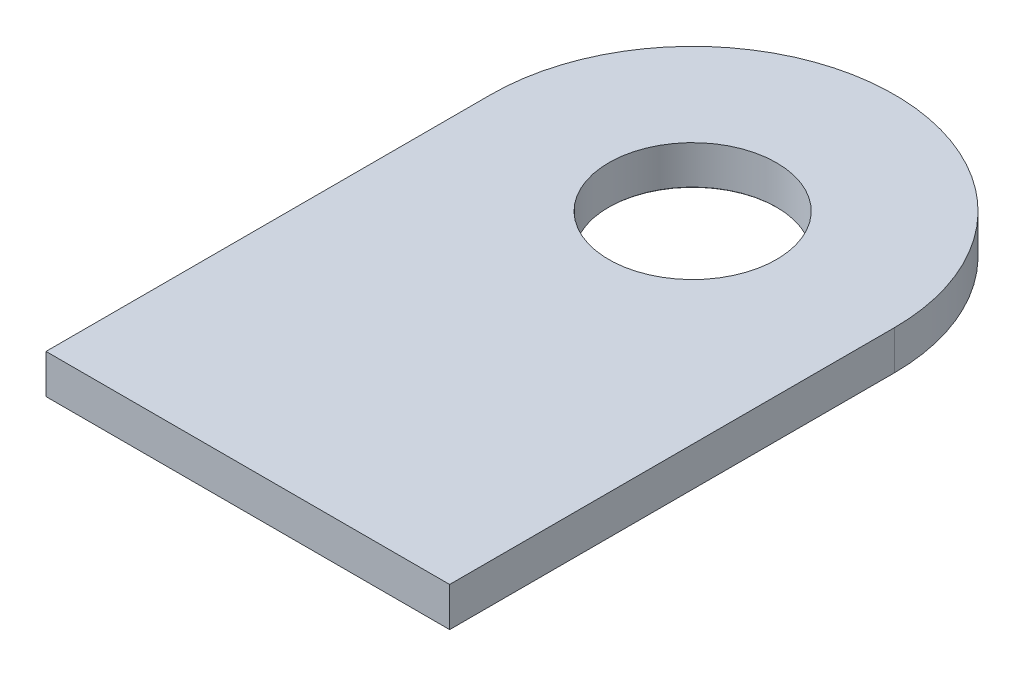
ISO-10303-21;
HEADER;
FILE_DESCRIPTION(('STEP AP214'),'2;1');
FILE_NAME('part.step','',(''),(''),'','','');
FILE_SCHEMA(('AUTOMOTIVE_DESIGN { 1 0 10303 214 1 1 1 1 }'));
ENDSEC;
DATA;
#1=APPLICATION_CONTEXT('core data for automotive mechanical design processes');
#2=APPLICATION_PROTOCOL_DEFINITION('international standard','automotive_design',2000,#1);
#3=PRODUCT_CONTEXT('',#1,'mechanical');
#4=PRODUCT('Part','Part','',(#3));
#5=PRODUCT_RELATED_PRODUCT_CATEGORY('part','',(#4));
#6=PRODUCT_DEFINITION_FORMATION('','',#4);
#7=PRODUCT_DEFINITION_CONTEXT('part definition',#1,'design');
#8=PRODUCT_DEFINITION('design','',#6,#7);
#9=PRODUCT_DEFINITION_SHAPE('','',#8);
#10=(LENGTH_UNIT() NAMED_UNIT(*) SI_UNIT(.MILLI.,.METRE.));
#11=(NAMED_UNIT(*) PLANE_ANGLE_UNIT() SI_UNIT($,.RADIAN.));
#12=(NAMED_UNIT(*) SI_UNIT($,.STERADIAN.) SOLID_ANGLE_UNIT());
#13=UNCERTAINTY_MEASURE_WITH_UNIT(LENGTH_MEASURE(1.E-05),#10,'distance_accuracy_value','');
#14=(GEOMETRIC_REPRESENTATION_CONTEXT(3) GLOBAL_UNCERTAINTY_ASSIGNED_CONTEXT((#13)) GLOBAL_UNIT_ASSIGNED_CONTEXT((#10,
#11,#12)) REPRESENTATION_CONTEXT('',''));
#15=CARTESIAN_POINT('',(0.,0.,0.));
#16=DIRECTION('',(0.,0.,1.));
#17=DIRECTION('',(1.,0.,0.));
#18=AXIS2_PLACEMENT_3D('',#15,#16,#17);
#19=CARTESIAN_POINT('',(0.,1.54,0.));
#20=DIRECTION('',(0.,-1.,0.));
#21=DIRECTION('',(0.,0.,-1.));
#22=AXIS2_PLACEMENT_3D('',#19,#20,#21);
#23=CYLINDRICAL_SURFACE('',#22,7.94);
#24=CARTESIAN_POINT('',(0.,0.,0.));
#25=DIRECTION('',(0.,1.,0.));
#26=DIRECTION('',(0.,0.,1.));
#27=AXIS2_PLACEMENT_3D('',#24,#25,#26);
#28=CIRCLE('',#27,7.94);
#29=CARTESIAN_POINT('',(7.94,0.,0.));
#30=VERTEX_POINT('',#29);
#31=CARTESIAN_POINT('',(-7.94,0.,0.));
#32=VERTEX_POINT('',#31);
#33=EDGE_CURVE('E131',#30,#32,#28,.T.);
#34=ORIENTED_EDGE('',*,*,#33,.T.);
#35=DIRECTION('',(0.,-1.,0.));
#36=VECTOR('',#35,1.);
#37=CARTESIAN_POINT('',(-7.94,1.54,0.));
#38=LINE('',#37,#36);
#39=CARTESIAN_POINT('',(-7.94,1.54,0.));
#40=VERTEX_POINT('',#39);
#41=EDGE_CURVE('E12',#40,#32,#38,.T.);
#42=ORIENTED_EDGE('',*,*,#41,.F.);
#43=CARTESIAN_POINT('',(0.,1.54,0.));
#44=DIRECTION('',(0.,1.,0.));
#45=DIRECTION('',(0.,0.,1.));
#46=AXIS2_PLACEMENT_3D('',#43,#44,#45);
#47=CIRCLE('',#46,7.94);
#48=CARTESIAN_POINT('',(7.94,1.54,0.));
#49=VERTEX_POINT('',#48);
#50=EDGE_CURVE('E102',#49,#40,#47,.T.);
#51=ORIENTED_EDGE('',*,*,#50,.F.);
#52=DIRECTION('',(0.,-1.,0.));
#53=VECTOR('',#52,1.);
#54=CARTESIAN_POINT('',(7.94,1.54,0.));
#55=LINE('',#54,#53);
#56=EDGE_CURVE('E114',#49,#30,#55,.T.);
#57=ORIENTED_EDGE('',*,*,#56,.T.);
#58=EDGE_LOOP('',(#34,#42,#51,#57));
#59=FACE_BOUND('',#58,.T.);
#60=ADVANCED_FACE('F50',(#59),#23,.T.);
#61=CARTESIAN_POINT('',(-7.94,1.54,0.));
#62=DIRECTION('',(1.,0.,0.));
#63=DIRECTION('',(0.,0.,-1.));
#64=AXIS2_PLACEMENT_3D('',#61,#62,#63);
#65=PLANE('',#64);
#66=DIRECTION('',(0.,0.,1.));
#67=VECTOR('',#66,1.);
#68=CARTESIAN_POINT('',(-7.94,0.,0.));
#69=LINE('',#68,#67);
#70=CARTESIAN_POINT('',(-7.94,0.,17.5));
#71=VERTEX_POINT('',#70);
#72=EDGE_CURVE('E107',#32,#71,#69,.T.);
#73=ORIENTED_EDGE('',*,*,#72,.T.);
#74=DIRECTION('',(0.,-1.,0.));
#75=VECTOR('',#74,1.);
#76=CARTESIAN_POINT('',(-7.94,1.54,17.5));
#77=LINE('',#76,#75);
#78=CARTESIAN_POINT('',(-7.94,1.54,17.5));
#79=VERTEX_POINT('',#78);
#80=EDGE_CURVE('E59',#79,#71,#77,.T.);
#81=ORIENTED_EDGE('',*,*,#80,.F.);
#82=DIRECTION('',(0.,0.,1.));
#83=VECTOR('',#82,1.);
#84=CARTESIAN_POINT('',(-7.94,1.54,0.));
#85=LINE('',#84,#83);
#86=EDGE_CURVE('E97',#40,#79,#85,.T.);
#87=ORIENTED_EDGE('',*,*,#86,.F.);
#88=ORIENTED_EDGE('',*,*,#41,.T.);
#89=EDGE_LOOP('',(#73,#81,#87,#88));
#90=FACE_BOUND('',#89,.T.);
#91=ADVANCED_FACE('F106',(#90),#65,.F.);
#92=CARTESIAN_POINT('',(0.,1.54,17.5));
#93=DIRECTION('',(0.,0.,-1.));
#94=DIRECTION('',(-1.,0.,0.));
#95=AXIS2_PLACEMENT_3D('',#92,#93,#94);
#96=PLANE('',#95);
#97=DIRECTION('',(1.,0.,0.));
#98=VECTOR('',#97,1.);
#99=CARTESIAN_POINT('',(0.,0.,17.5));
#100=LINE('',#99,#98);
#101=CARTESIAN_POINT('',(7.94,0.,17.5));
#102=VERTEX_POINT('',#101);
#103=EDGE_CURVE('E84',#71,#102,#100,.T.);
#104=ORIENTED_EDGE('',*,*,#103,.T.);
#105=DIRECTION('',(0.,-1.,0.));
#106=VECTOR('',#105,1.);
#107=CARTESIAN_POINT('',(7.94,1.54,17.5));
#108=LINE('',#107,#106);
#109=CARTESIAN_POINT('',(7.94,1.54,17.5));
#110=VERTEX_POINT('',#109);
#111=EDGE_CURVE('E109',#110,#102,#108,.T.);
#112=ORIENTED_EDGE('',*,*,#111,.F.);
#113=DIRECTION('',(1.,0.,0.));
#114=VECTOR('',#113,1.);
#115=CARTESIAN_POINT('',(0.,1.54,17.5));
#116=LINE('',#115,#114);
#117=EDGE_CURVE('E100',#79,#110,#116,.T.);
#118=ORIENTED_EDGE('',*,*,#117,.F.);
#119=ORIENTED_EDGE('',*,*,#80,.T.);
#120=EDGE_LOOP('',(#104,#112,#118,#119));
#121=FACE_BOUND('',#120,.T.);
#122=ADVANCED_FACE('F110',(#121),#96,.F.);
#123=CARTESIAN_POINT('',(7.94,1.54,0.));
#124=DIRECTION('',(-1.,0.,0.));
#125=DIRECTION('',(0.,0.,1.));
#126=AXIS2_PLACEMENT_3D('',#123,#124,#125);
#127=PLANE('',#126);
#128=DIRECTION('',(0.,0.,-1.));
#129=VECTOR('',#128,1.);
#130=CARTESIAN_POINT('',(7.94,0.,0.));
#131=LINE('',#130,#129);
#132=EDGE_CURVE('E90',#102,#30,#131,.T.);
#133=ORIENTED_EDGE('',*,*,#132,.T.);
#134=ORIENTED_EDGE('',*,*,#56,.F.);
#135=DIRECTION('',(0.,0.,-1.));
#136=VECTOR('',#135,1.);
#137=CARTESIAN_POINT('',(7.94,1.54,0.));
#138=LINE('',#137,#136);
#139=EDGE_CURVE('E67',#110,#49,#138,.T.);
#140=ORIENTED_EDGE('',*,*,#139,.F.);
#141=ORIENTED_EDGE('',*,*,#111,.T.);
#142=EDGE_LOOP('',(#133,#134,#140,#141));
#143=FACE_BOUND('',#142,.T.);
#144=ADVANCED_FACE('F162',(#143),#127,.F.);
#145=CARTESIAN_POINT('',(0.,1.54,0.));
#146=DIRECTION('',(0.,1.,0.));
#147=DIRECTION('',(0.,0.,1.));
#148=AXIS2_PLACEMENT_3D('',#145,#146,#147);
#149=PLANE('',#148);
#150=CARTESIAN_POINT('',(0.,1.54,0.));
#151=DIRECTION('',(0.,-1.,0.));
#152=DIRECTION('',(0.,0.,-1.));
#153=AXIS2_PLACEMENT_3D('',#150,#151,#152);
#154=CIRCLE('',#153,3.3);
#155=CARTESIAN_POINT('',(0.,1.54,-3.3));
#156=VERTEX_POINT('',#155);
#157=EDGE_CURVE('E126',#156,#156,#154,.T.);
#158=ORIENTED_EDGE('',*,*,#157,.T.);
#159=EDGE_LOOP('',(#158));
#160=FACE_BOUND('',#159,.T.);
#161=ORIENTED_EDGE('',*,*,#50,.T.);
#162=ORIENTED_EDGE('',*,*,#86,.T.);
#163=ORIENTED_EDGE('',*,*,#117,.T.);
#164=ORIENTED_EDGE('',*,*,#139,.T.);
#165=EDGE_LOOP('',(#161,#162,#163,#164));
#166=FACE_BOUND('',#165,.T.);
#167=ADVANCED_FACE('F98',(#160,#166),#149,.T.);
#168=CARTESIAN_POINT('',(0.,0.,0.));
#169=DIRECTION('',(0.,1.,0.));
#170=DIRECTION('',(0.,0.,1.));
#171=AXIS2_PLACEMENT_3D('',#168,#169,#170);
#172=PLANE('',#171);
#173=CARTESIAN_POINT('',(0.,0.,0.));
#174=DIRECTION('',(0.,-1.,0.));
#175=DIRECTION('',(0.,0.,-1.));
#176=AXIS2_PLACEMENT_3D('',#173,#174,#175);
#177=CIRCLE('',#176,3.325);
#178=CARTESIAN_POINT('',(0.,0.,-3.325));
#179=VERTEX_POINT('',#178);
#180=EDGE_CURVE('E136',#179,#179,#177,.T.);
#181=ORIENTED_EDGE('',*,*,#180,.F.);
#182=EDGE_LOOP('',(#181));
#183=FACE_BOUND('',#182,.T.);
#184=ORIENTED_EDGE('',*,*,#33,.F.);
#185=ORIENTED_EDGE('',*,*,#132,.F.);
#186=ORIENTED_EDGE('',*,*,#103,.F.);
#187=ORIENTED_EDGE('',*,*,#72,.F.);
#188=EDGE_LOOP('',(#184,#185,#186,#187));
#189=FACE_BOUND('',#188,.T.);
#190=ADVANCED_FACE('F143',(#183,#189),#172,.F.);
#191=CARTESIAN_POINT('',(0.,0.,0.));
#192=DIRECTION('',(0.,-1.,0.));
#193=DIRECTION('',(0.,0.,-1.));
#194=AXIS2_PLACEMENT_3D('',#191,#192,#193);
#195=CYLINDRICAL_SURFACE('',#194,3.3);
#196=ORIENTED_EDGE('',*,*,#157,.F.);
#197=EDGE_LOOP('',(#196));
#198=FACE_BOUND('',#197,.T.);
#199=CARTESIAN_POINT('',(0.,0.0249999999999998,0.));
#200=DIRECTION('',(0.,-1.,0.));
#201=DIRECTION('',(0.,0.,-1.));
#202=AXIS2_PLACEMENT_3D('',#199,#200,#201);
#203=CIRCLE('',#202,3.3);
#204=CARTESIAN_POINT('',(0.,0.0249999999999998,-3.3));
#205=VERTEX_POINT('',#204);
#206=EDGE_CURVE('E132',#205,#205,#203,.T.);
#207=ORIENTED_EDGE('',*,*,#206,.T.);
#208=EDGE_LOOP('',(#207));
#209=FACE_BOUND('',#208,.T.);
#210=ADVANCED_FACE('F146',(#198,#209),#195,.F.);
#211=CARTESIAN_POINT('',(0.,0.,0.));
#212=DIRECTION('',(0.,-1.,0.));
#213=DIRECTION('',(0.,0.,-1.));
#214=AXIS2_PLACEMENT_3D('',#211,#212,#213);
#215=CONICAL_SURFACE('',#214,3.325,0.785398163397414);
#216=ORIENTED_EDGE('',*,*,#206,.F.);
#217=EDGE_LOOP('',(#216));
#218=FACE_BOUND('',#217,.T.);
#219=ORIENTED_EDGE('',*,*,#180,.T.);
#220=EDGE_LOOP('',(#219));
#221=FACE_BOUND('',#220,.T.);
#222=ADVANCED_FACE('F141',(#218,#221),#215,.F.);
#223=CLOSED_SHELL('',(#60,#91,#122,#144,#167,#190,#210,#222));
#224=MANIFOLD_SOLID_BREP('B2',#223);
#225=ADVANCED_BREP_SHAPE_REPRESENTATION('',(#18,#224),#14);
#226=SHAPE_DEFINITION_REPRESENTATION(#9,#225);
ENDSEC;
END-ISO-10303-21;
